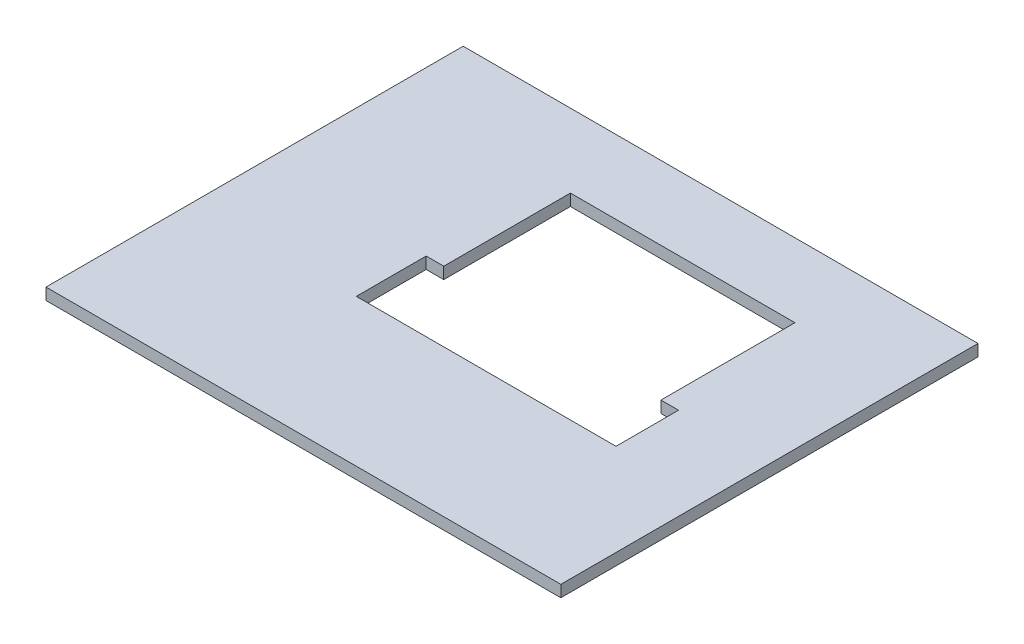
ISO-10303-21;
HEADER;
FILE_DESCRIPTION(('STEP AP214'),'2;1');
FILE_NAME('part.step','',(''),(''),'','','');
FILE_SCHEMA(('AUTOMOTIVE_DESIGN { 1 0 10303 214 1 1 1 1 }'));
ENDSEC;
DATA;
#1=APPLICATION_CONTEXT('core data for automotive mechanical design processes');
#2=APPLICATION_PROTOCOL_DEFINITION('international standard','automotive_design',2000,#1);
#3=PRODUCT_CONTEXT('',#1,'mechanical');
#4=PRODUCT('Part','Part','',(#3));
#5=PRODUCT_RELATED_PRODUCT_CATEGORY('part','',(#4));
#6=PRODUCT_DEFINITION_FORMATION('','',#4);
#7=PRODUCT_DEFINITION_CONTEXT('part definition',#1,'design');
#8=PRODUCT_DEFINITION('design','',#6,#7);
#9=PRODUCT_DEFINITION_SHAPE('','',#8);
#10=(LENGTH_UNIT() NAMED_UNIT(*) SI_UNIT(.MILLI.,.METRE.));
#11=(NAMED_UNIT(*) PLANE_ANGLE_UNIT() SI_UNIT($,.RADIAN.));
#12=(NAMED_UNIT(*) SI_UNIT($,.STERADIAN.) SOLID_ANGLE_UNIT());
#13=UNCERTAINTY_MEASURE_WITH_UNIT(LENGTH_MEASURE(1.E-05),#10,'distance_accuracy_value','');
#14=(GEOMETRIC_REPRESENTATION_CONTEXT(3) GLOBAL_UNCERTAINTY_ASSIGNED_CONTEXT((#13)) GLOBAL_UNIT_ASSIGNED_CONTEXT((#10,
#11,#12)) REPRESENTATION_CONTEXT('',''));
#15=CARTESIAN_POINT('',(0.,0.,0.));
#16=DIRECTION('',(0.,0.,1.));
#17=DIRECTION('',(1.,0.,0.));
#18=AXIS2_PLACEMENT_3D('',#15,#16,#17);
#19=CARTESIAN_POINT('',(-35.,1.5875,0.));
#20=DIRECTION('',(1.,0.,0.));
#21=DIRECTION('',(0.,0.,-1.));
#22=AXIS2_PLACEMENT_3D('',#19,#20,#21);
#23=PLANE('',#22);
#24=DIRECTION('',(0.,0.,1.));
#25=VECTOR('',#24,1.);
#26=CARTESIAN_POINT('',(-35.,0.,0.));
#27=LINE('',#26,#25);
#28=CARTESIAN_POINT('',(-35.,0.,-56.72));
#29=VERTEX_POINT('',#28);
#30=CARTESIAN_POINT('',(-35.,0.,0.));
#31=VERTEX_POINT('',#30);
#32=EDGE_CURVE('E274',#29,#31,#27,.T.);
#33=ORIENTED_EDGE('',*,*,#32,.T.);
#34=DIRECTION('',(0.,-1.,0.));
#35=VECTOR('',#34,1.);
#36=CARTESIAN_POINT('',(-35.,1.5875,0.));
#37=LINE('',#36,#35);
#38=CARTESIAN_POINT('',(-35.,1.5875,0.));
#39=VERTEX_POINT('',#38);
#40=EDGE_CURVE('E304',#39,#31,#37,.T.);
#41=ORIENTED_EDGE('',*,*,#40,.F.);
#42=DIRECTION('',(0.,0.,1.));
#43=VECTOR('',#42,1.);
#44=CARTESIAN_POINT('',(-35.,1.5875,0.));
#45=LINE('',#44,#43);
#46=CARTESIAN_POINT('',(-35.,1.5875,-56.72));
#47=VERTEX_POINT('',#46);
#48=EDGE_CURVE('E275',#47,#39,#45,.T.);
#49=ORIENTED_EDGE('',*,*,#48,.F.);
#50=DIRECTION('',(0.,-1.,0.));
#51=VECTOR('',#50,1.);
#52=CARTESIAN_POINT('',(-35.,1.5875,-56.72));
#53=LINE('',#52,#51);
#54=EDGE_CURVE('E288',#47,#29,#53,.T.);
#55=ORIENTED_EDGE('',*,*,#54,.T.);
#56=EDGE_LOOP('',(#33,#41,#49,#55));
#57=FACE_BOUND('',#56,.T.);
#58=ADVANCED_FACE('F57',(#57),#23,.F.);
#59=CARTESIAN_POINT('',(-35.,1.5875,0.));
#60=DIRECTION('',(0.,0.,-1.));
#61=DIRECTION('',(-1.,0.,0.));
#62=AXIS2_PLACEMENT_3D('',#59,#60,#61);
#63=PLANE('',#62);
#64=DIRECTION('',(1.,0.,0.));
#65=VECTOR('',#64,1.);
#66=CARTESIAN_POINT('',(-35.,0.,0.));
#67=LINE('',#66,#65);
#68=CARTESIAN_POINT('',(35.,0.,0.));
#69=VERTEX_POINT('',#68);
#70=EDGE_CURVE('E291',#31,#69,#67,.T.);
#71=ORIENTED_EDGE('',*,*,#70,.T.);
#72=DIRECTION('',(0.,-1.,0.));
#73=VECTOR('',#72,1.);
#74=CARTESIAN_POINT('',(35.,1.5875,0.));
#75=LINE('',#74,#73);
#76=CARTESIAN_POINT('',(35.,1.5875,0.));
#77=VERTEX_POINT('',#76);
#78=EDGE_CURVE('E301',#77,#69,#75,.T.);
#79=ORIENTED_EDGE('',*,*,#78,.F.);
#80=DIRECTION('',(1.,0.,0.));
#81=VECTOR('',#80,1.);
#82=CARTESIAN_POINT('',(-35.,1.5875,0.));
#83=LINE('',#82,#81);
#84=EDGE_CURVE('E281',#39,#77,#83,.T.);
#85=ORIENTED_EDGE('',*,*,#84,.F.);
#86=ORIENTED_EDGE('',*,*,#40,.T.);
#87=EDGE_LOOP('',(#71,#79,#85,#86));
#88=FACE_BOUND('',#87,.T.);
#89=ADVANCED_FACE('F380',(#88),#63,.F.);
#90=CARTESIAN_POINT('',(35.,1.5875,0.));
#91=DIRECTION('',(-1.,0.,0.));
#92=DIRECTION('',(0.,0.,1.));
#93=AXIS2_PLACEMENT_3D('',#90,#91,#92);
#94=PLANE('',#93);
#95=DIRECTION('',(0.,0.,-1.));
#96=VECTOR('',#95,1.);
#97=CARTESIAN_POINT('',(35.,0.,0.));
#98=LINE('',#97,#96);
#99=CARTESIAN_POINT('',(35.,0.,-56.72));
#100=VERTEX_POINT('',#99);
#101=EDGE_CURVE('E293',#69,#100,#98,.T.);
#102=ORIENTED_EDGE('',*,*,#101,.T.);
#103=DIRECTION('',(0.,-1.,0.));
#104=VECTOR('',#103,1.);
#105=CARTESIAN_POINT('',(35.,1.5875,-56.72));
#106=LINE('',#105,#104);
#107=CARTESIAN_POINT('',(35.,1.5875,-56.72));
#108=VERTEX_POINT('',#107);
#109=EDGE_CURVE('E298',#108,#100,#106,.T.);
#110=ORIENTED_EDGE('',*,*,#109,.F.);
#111=DIRECTION('',(0.,0.,-1.));
#112=VECTOR('',#111,1.);
#113=CARTESIAN_POINT('',(35.,1.5875,0.));
#114=LINE('',#113,#112);
#115=EDGE_CURVE('E284',#77,#108,#114,.T.);
#116=ORIENTED_EDGE('',*,*,#115,.F.);
#117=ORIENTED_EDGE('',*,*,#78,.T.);
#118=EDGE_LOOP('',(#102,#110,#116,#117));
#119=FACE_BOUND('',#118,.T.);
#120=ADVANCED_FACE('F385',(#119),#94,.F.);
#121=CARTESIAN_POINT('',(-35.,1.5875,-56.72));
#122=DIRECTION('',(0.,0.,1.));
#123=DIRECTION('',(1.,0.,0.));
#124=AXIS2_PLACEMENT_3D('',#121,#122,#123);
#125=PLANE('',#124);
#126=DIRECTION('',(-1.,0.,0.));
#127=VECTOR('',#126,1.);
#128=CARTESIAN_POINT('',(-35.,0.,-56.72));
#129=LINE('',#128,#127);
#130=EDGE_CURVE('E282',#100,#29,#129,.T.);
#131=ORIENTED_EDGE('',*,*,#130,.T.);
#132=ORIENTED_EDGE('',*,*,#54,.F.);
#133=DIRECTION('',(-1.,0.,0.));
#134=VECTOR('',#133,1.);
#135=CARTESIAN_POINT('',(-35.,1.5875,-56.72));
#136=LINE('',#135,#134);
#137=EDGE_CURVE('E286',#108,#47,#136,.T.);
#138=ORIENTED_EDGE('',*,*,#137,.F.);
#139=ORIENTED_EDGE('',*,*,#109,.T.);
#140=EDGE_LOOP('',(#131,#132,#138,#139));
#141=FACE_BOUND('',#140,.T.);
#142=ADVANCED_FACE('F398',(#141),#125,.F.);
#143=CARTESIAN_POINT('',(0.,1.5875,0.));
#144=DIRECTION('',(0.,-1.,0.));
#145=DIRECTION('',(0.,0.,-1.));
#146=AXIS2_PLACEMENT_3D('',#143,#144,#145);
#147=PLANE('',#146);
#148=CARTESIAN_POINT('',(-12.8099536822238,1.587500000334,-29.4999965155704));
#149=CARTESIAN_POINT('',(-12.8099536822238,1.587500000334,-26.3333310254204));
#150=CARTESIAN_POINT('',(-12.8099536822238,1.587500000334,-23.1666655352704));
#151=CARTESIAN_POINT('',(-12.8099536822238,1.587500000334,-20.0000000451204));
#152=(BOUNDED_CURVE() B_SPLINE_CURVE(3,(#148,#149,#150,#151),.UNSPECIFIED.,.F.,
.F.) B_SPLINE_CURVE_WITH_KNOTS((4,4),(0.,1.),
.UNSPECIFIED.) CURVE() GEOMETRIC_REPRESENTATION_ITEM() RATIONAL_B_SPLINE_CURVE((1.,1.,1.,1.)) REPRESENTATION_ITEM(''));
#153=CARTESIAN_POINT('',(-12.8099536822238,1.587500000334,-29.4999965155704));
#154=VERTEX_POINT('',#153);
#155=CARTESIAN_POINT('',(-12.8099536822238,1.587500000334,-20.0000000451204));
#156=VERTEX_POINT('',#155);
#157=EDGE_CURVE('E172',#154,#156,#152,.T.);
#158=ORIENTED_EDGE('',*,*,#157,.F.);
#159=CARTESIAN_POINT('',(-10.4199536822238,1.587500000334,-29.4999965155704));
#160=CARTESIAN_POINT('',(-11.2166203488905,1.587500000334,-29.4999965155704));
#161=CARTESIAN_POINT('',(-12.0132870155571,1.587500000334,-29.4999965155704));
#162=CARTESIAN_POINT('',(-12.8099536822238,1.587500000334,-29.4999965155704));
#163=(BOUNDED_CURVE() B_SPLINE_CURVE(3,(#159,#160,#161,#162),.UNSPECIFIED.,.F.,
.F.) B_SPLINE_CURVE_WITH_KNOTS((4,4),(0.,1.),
.UNSPECIFIED.) CURVE() GEOMETRIC_REPRESENTATION_ITEM() RATIONAL_B_SPLINE_CURVE((1.,1.,1.,1.)) REPRESENTATION_ITEM(''));
#164=CARTESIAN_POINT('',(-10.4199536822238,1.587500000334,-29.4999965155704));
#165=VERTEX_POINT('',#164);
#166=EDGE_CURVE('E179',#165,#154,#163,.T.);
#167=ORIENTED_EDGE('',*,*,#166,.F.);
#168=CARTESIAN_POINT('',(-10.4199536822238,1.587500000334,-46.7200000451204));
#169=CARTESIAN_POINT('',(-10.4199536822238,1.587500000334,-40.9799988686037));
#170=CARTESIAN_POINT('',(-10.4199536822238,1.587500000334,-35.2399976920871));
#171=CARTESIAN_POINT('',(-10.4199536822238,1.587500000334,-29.4999965155704));
#172=(BOUNDED_CURVE() B_SPLINE_CURVE(3,(#168,#169,#170,#171),.UNSPECIFIED.,.F.,
.F.) B_SPLINE_CURVE_WITH_KNOTS((4,4),(0.,1.),
.UNSPECIFIED.) CURVE() GEOMETRIC_REPRESENTATION_ITEM() RATIONAL_B_SPLINE_CURVE((1.,1.,1.,1.)) REPRESENTATION_ITEM(''));
#173=CARTESIAN_POINT('',(-10.4199536822238,1.5875,-46.7200000451204));
#174=VERTEX_POINT('',#173);
#175=EDGE_CURVE('E341',#174,#165,#172,.T.);
#176=ORIENTED_EDGE('',*,*,#175,.F.);
#177=CARTESIAN_POINT('',(20.1100463177762,1.587500000334,-46.7200000451204));
#178=CARTESIAN_POINT('',(9.93337965110952,1.587500000334,-46.7200000451204));
#179=CARTESIAN_POINT('',(-0.243287015557145,1.587500000334,-46.7200000451204));
#180=CARTESIAN_POINT('',(-10.4199536822238,1.587500000334,-46.7200000451204));
#181=(BOUNDED_CURVE() B_SPLINE_CURVE(3,(#177,#178,#179,#180),.UNSPECIFIED.,.F.,
.F.) B_SPLINE_CURVE_WITH_KNOTS((4,4),(0.,1.),
.UNSPECIFIED.) CURVE() GEOMETRIC_REPRESENTATION_ITEM() RATIONAL_B_SPLINE_CURVE((1.,1.,1.,1.)) REPRESENTATION_ITEM(''));
#182=CARTESIAN_POINT('',(20.1100463177762,1.587500000334,-46.7200000451204));
#183=VERTEX_POINT('',#182);
#184=EDGE_CURVE('E74',#183,#174,#181,.T.);
#185=ORIENTED_EDGE('',*,*,#184,.F.);
#186=CARTESIAN_POINT('',(20.1100463177762,1.587500000334,-28.5000000022704));
#187=CARTESIAN_POINT('',(20.1100463177762,1.587500000334,-34.5733333498871));
#188=CARTESIAN_POINT('',(20.1100463177762,1.587500000334,-40.6466666975037));
#189=CARTESIAN_POINT('',(20.1100463177762,1.587500000334,-46.7200000451204));
#190=(BOUNDED_CURVE() B_SPLINE_CURVE(3,(#186,#187,#188,#189),.UNSPECIFIED.,.F.,
.F.) B_SPLINE_CURVE_WITH_KNOTS((4,4),(0.,1.),
.UNSPECIFIED.) CURVE() GEOMETRIC_REPRESENTATION_ITEM() RATIONAL_B_SPLINE_CURVE((1.,1.,1.,1.)) REPRESENTATION_ITEM(''));
#191=CARTESIAN_POINT('',(20.1100463177762,1.587500000334,-28.5000000022704));
#192=VERTEX_POINT('',#191);
#193=EDGE_CURVE('E220',#192,#183,#190,.T.);
#194=ORIENTED_EDGE('',*,*,#193,.F.);
#195=CARTESIAN_POINT('',(22.5000000311962,1.587500000334,-28.5000000022704));
#196=CARTESIAN_POINT('',(21.7033487933895,1.587500000334,-28.5000000022704));
#197=CARTESIAN_POINT('',(20.9066975555829,1.587500000334,-28.5000000022704));
#198=CARTESIAN_POINT('',(20.1100463177762,1.587500000334,-28.5000000022704));
#199=(BOUNDED_CURVE() B_SPLINE_CURVE(3,(#195,#196,#197,#198),.UNSPECIFIED.,.F.,
.F.) B_SPLINE_CURVE_WITH_KNOTS((4,4),(0.,1.),
.UNSPECIFIED.) CURVE() GEOMETRIC_REPRESENTATION_ITEM() RATIONAL_B_SPLINE_CURVE((1.,1.,1.,1.)) REPRESENTATION_ITEM(''));
#200=CARTESIAN_POINT('',(22.5000000311962,1.587500000334,-28.5000000022704));
#201=VERTEX_POINT('',#200);
#202=EDGE_CURVE('E190',#201,#192,#199,.T.);
#203=ORIENTED_EDGE('',*,*,#202,.F.);
#204=CARTESIAN_POINT('',(22.5000000311962,1.587500000334,-20.0000000451204));
#205=CARTESIAN_POINT('',(22.5000000311962,1.587500000334,-22.8333333641704));
#206=CARTESIAN_POINT('',(22.5000000311962,1.587500000334,-25.6666666832204));
#207=CARTESIAN_POINT('',(22.5000000311962,1.587500000334,-28.5000000022704));
#208=(BOUNDED_CURVE() B_SPLINE_CURVE(3,(#204,#205,#206,#207),.UNSPECIFIED.,.F.,
.F.) B_SPLINE_CURVE_WITH_KNOTS((4,4),(0.,1.),
.UNSPECIFIED.) CURVE() GEOMETRIC_REPRESENTATION_ITEM() RATIONAL_B_SPLINE_CURVE((1.,1.,1.,1.)) REPRESENTATION_ITEM(''));
#209=CARTESIAN_POINT('',(22.5000000311962,1.587500000334,-20.0000000451204));
#210=VERTEX_POINT('',#209);
#211=EDGE_CURVE('E185',#210,#201,#208,.T.);
#212=ORIENTED_EDGE('',*,*,#211,.F.);
#213=CARTESIAN_POINT('',(-12.8099536822238,1.587500000334,-20.0000000451204));
#214=CARTESIAN_POINT('',(-1.03996911108382,1.587500000334,-20.0000000451204));
#215=CARTESIAN_POINT('',(10.7300154600562,1.587500000334,-20.0000000451204));
#216=CARTESIAN_POINT('',(22.5000000311962,1.587500000334,-20.0000000451204));
#217=(BOUNDED_CURVE() B_SPLINE_CURVE(3,(#213,#214,#215,#216),.UNSPECIFIED.,.F.,
.F.) B_SPLINE_CURVE_WITH_KNOTS((4,4),(0.,1.),
.UNSPECIFIED.) CURVE() GEOMETRIC_REPRESENTATION_ITEM() RATIONAL_B_SPLINE_CURVE((1.,1.,1.,1.)) REPRESENTATION_ITEM(''));
#218=EDGE_CURVE('E161',#156,#210,#217,.T.);
#219=ORIENTED_EDGE('',*,*,#218,.F.);
#220=EDGE_LOOP('',(#158,#167,#176,#185,#194,#203,#212,#219));
#221=FACE_BOUND('',#220,.T.);
#222=ORIENTED_EDGE('',*,*,#48,.T.);
#223=ORIENTED_EDGE('',*,*,#84,.T.);
#224=ORIENTED_EDGE('',*,*,#115,.T.);
#225=ORIENTED_EDGE('',*,*,#137,.T.);
#226=EDGE_LOOP('',(#222,#223,#224,#225));
#227=FACE_BOUND('',#226,.T.);
#228=ADVANCED_FACE('F181',(#221,#227),#147,.F.);
#229=CARTESIAN_POINT('',(0.,0.,0.));
#230=DIRECTION('',(0.,-1.,0.));
#231=DIRECTION('',(0.,0.,-1.));
#232=AXIS2_PLACEMENT_3D('',#229,#230,#231);
#233=PLANE('',#232);
#234=DIRECTION('',(1.,0.,0.));
#235=VECTOR('',#234,1.);
#236=CARTESIAN_POINT('',(0.,0.,-29.4999965155704));
#237=LINE('',#236,#235);
#238=CARTESIAN_POINT('',(-12.8099536822238,0.,-29.4999965155704));
#239=VERTEX_POINT('',#238);
#240=CARTESIAN_POINT('',(-10.4199536822238,0.,-29.4999965155704));
#241=VERTEX_POINT('',#240);
#242=EDGE_CURVE('E11',#239,#241,#237,.T.);
#243=ORIENTED_EDGE('',*,*,#242,.F.);
#244=DIRECTION('',(0.,0.,-1.));
#245=VECTOR('',#244,1.);
#246=CARTESIAN_POINT('',(-12.8099536822238,0.,0.));
#247=LINE('',#246,#245);
#248=CARTESIAN_POINT('',(-12.8099536822238,0.,-20.0000000451204));
#249=VERTEX_POINT('',#248);
#250=EDGE_CURVE('E64',#249,#239,#247,.T.);
#251=ORIENTED_EDGE('',*,*,#250,.F.);
#252=DIRECTION('',(-1.,0.,0.));
#253=VECTOR('',#252,1.);
#254=CARTESIAN_POINT('',(0.,0.,-20.0000000451204));
#255=LINE('',#254,#253);
#256=CARTESIAN_POINT('',(22.5000000311962,0.,-20.0000000451204));
#257=VERTEX_POINT('',#256);
#258=EDGE_CURVE('E164',#257,#249,#255,.T.);
#259=ORIENTED_EDGE('',*,*,#258,.F.);
#260=DIRECTION('',(0.,0.,1.));
#261=VECTOR('',#260,1.);
#262=CARTESIAN_POINT('',(22.5000000311962,0.,0.));
#263=LINE('',#262,#261);
#264=CARTESIAN_POINT('',(22.5000000311962,0.,-28.5000000022704));
#265=VERTEX_POINT('',#264);
#266=EDGE_CURVE('E315',#265,#257,#263,.T.);
#267=ORIENTED_EDGE('',*,*,#266,.F.);
#268=DIRECTION('',(1.,0.,0.));
#269=VECTOR('',#268,1.);
#270=CARTESIAN_POINT('',(0.,0.,-28.5000000022704));
#271=LINE('',#270,#269);
#272=CARTESIAN_POINT('',(20.1100463177762,0.,-28.5000000022704));
#273=VERTEX_POINT('',#272);
#274=EDGE_CURVE('E313',#273,#265,#271,.T.);
#275=ORIENTED_EDGE('',*,*,#274,.F.);
#276=DIRECTION('',(0.,0.,1.));
#277=VECTOR('',#276,1.);
#278=CARTESIAN_POINT('',(20.1100463177762,0.,0.));
#279=LINE('',#278,#277);
#280=CARTESIAN_POINT('',(20.1100463177762,0.,-46.7200000451204));
#281=VERTEX_POINT('',#280);
#282=EDGE_CURVE('E311',#281,#273,#279,.T.);
#283=ORIENTED_EDGE('',*,*,#282,.F.);
#284=DIRECTION('',(1.,0.,0.));
#285=VECTOR('',#284,1.);
#286=CARTESIAN_POINT('',(0.,0.,-46.7200000451204));
#287=LINE('',#286,#285);
#288=CARTESIAN_POINT('',(-10.4199536822238,0.,-46.7200000451204));
#289=VERTEX_POINT('',#288);
#290=EDGE_CURVE('E309',#289,#281,#287,.T.);
#291=ORIENTED_EDGE('',*,*,#290,.F.);
#292=DIRECTION('',(0.,0.,-1.));
#293=VECTOR('',#292,1.);
#294=CARTESIAN_POINT('',(-10.4199536822238,0.,0.));
#295=LINE('',#294,#293);
#296=EDGE_CURVE('E307',#241,#289,#295,.T.);
#297=ORIENTED_EDGE('',*,*,#296,.F.);
#298=EDGE_LOOP('',(#243,#251,#259,#267,#275,#283,#291,#297));
#299=FACE_BOUND('',#298,.T.);
#300=ORIENTED_EDGE('',*,*,#32,.F.);
#301=ORIENTED_EDGE('',*,*,#130,.F.);
#302=ORIENTED_EDGE('',*,*,#101,.F.);
#303=ORIENTED_EDGE('',*,*,#70,.F.);
#304=EDGE_LOOP('',(#300,#301,#302,#303));
#305=FACE_BOUND('',#304,.T.);
#306=ADVANCED_FACE('F322',(#299,#305),#233,.T.);
#307=CARTESIAN_POINT('',(-10.4199536822238,1.587500000334,-29.4999965155704));
#308=DIRECTION('',(0.,0.,-1.));
#309=DIRECTION('',(0.,-1.,0.));
#310=AXIS2_PLACEMENT_3D('',#307,#308,#309);
#311=PLANE('',#310);
#312=ORIENTED_EDGE('',*,*,#242,.T.);
#313=CARTESIAN_POINT('',(-10.4199536822238,-0.0124999996659984,-29.4999965155704));
#314=CARTESIAN_POINT('',(-10.4199536822238,0.520833333667302,-29.4999965155704));
#315=CARTESIAN_POINT('',(-10.4199536822238,1.0541666670007,-29.4999965155704));
#316=CARTESIAN_POINT('',(-10.4199536822238,1.587500000334,-29.4999965155704));
#317=(BOUNDED_CURVE() B_SPLINE_CURVE(3,(#313,#314,#315,#316),.UNSPECIFIED.,.F.,
.F.) B_SPLINE_CURVE_WITH_KNOTS((4,4),(0.,1.),
.UNSPECIFIED.) CURVE() GEOMETRIC_REPRESENTATION_ITEM() RATIONAL_B_SPLINE_CURVE((1.,1.,1.,1.)) REPRESENTATION_ITEM(''));
#318=EDGE_CURVE('E82',#241,#165,#317,.T.);
#319=ORIENTED_EDGE('',*,*,#318,.T.);
#320=ORIENTED_EDGE('',*,*,#166,.T.);
#321=CARTESIAN_POINT('',(-12.8099536822238,1.587500000334,-29.4999965155704));
#322=CARTESIAN_POINT('',(-12.8099536822238,1.0541666670007,-29.4999965155704));
#323=CARTESIAN_POINT('',(-12.8099536822238,0.520833333667302,-29.4999965155704));
#324=CARTESIAN_POINT('',(-12.8099536822238,-0.0124999996659984,-29.4999965155704));
#325=(BOUNDED_CURVE() B_SPLINE_CURVE(3,(#321,#322,#323,#324),.UNSPECIFIED.,.F.,
.F.) B_SPLINE_CURVE_WITH_KNOTS((4,4),(0.,1.),
.UNSPECIFIED.) CURVE() GEOMETRIC_REPRESENTATION_ITEM() RATIONAL_B_SPLINE_CURVE((1.,1.,1.,1.)) REPRESENTATION_ITEM(''));
#326=EDGE_CURVE('E168',#154,#239,#325,.T.);
#327=ORIENTED_EDGE('',*,*,#326,.T.);
#328=EDGE_LOOP('',(#312,#319,#320,#327));
#329=FACE_BOUND('',#328,.T.);
#330=ADVANCED_FACE('F320',(#329),#311,.F.);
#331=CARTESIAN_POINT('',(-12.8099536822238,-0.0124999996659984,-20.0000000451204));
#332=DIRECTION('',(-1.,0.,0.));
#333=DIRECTION('',(0.,0.,1.));
#334=AXIS2_PLACEMENT_3D('',#331,#332,#333);
#335=PLANE('',#334);
#336=ORIENTED_EDGE('',*,*,#250,.T.);
#337=ORIENTED_EDGE('',*,*,#326,.F.);
#338=ORIENTED_EDGE('',*,*,#157,.T.);
#339=CARTESIAN_POINT('',(-12.8099536822238,1.587500000334,-20.0000000451204));
#340=CARTESIAN_POINT('',(-12.8099536822238,1.0541666670007,-20.0000000451204));
#341=CARTESIAN_POINT('',(-12.8099536822238,0.520833333667302,-20.0000000451204));
#342=CARTESIAN_POINT('',(-12.8099536822238,-0.0124999996659984,-20.0000000451204));
#343=(BOUNDED_CURVE() B_SPLINE_CURVE(3,(#339,#340,#341,#342),.UNSPECIFIED.,.F.,
.F.) B_SPLINE_CURVE_WITH_KNOTS((4,4),(0.,1.),
.UNSPECIFIED.) CURVE() GEOMETRIC_REPRESENTATION_ITEM() RATIONAL_B_SPLINE_CURVE((1.,1.,1.,1.)) REPRESENTATION_ITEM(''));
#344=EDGE_CURVE('E156',#156,#249,#343,.T.);
#345=ORIENTED_EDGE('',*,*,#344,.T.);
#346=EDGE_LOOP('',(#336,#337,#338,#345));
#347=FACE_BOUND('',#346,.T.);
#348=ADVANCED_FACE('F173',(#347),#335,.F.);
#349=CARTESIAN_POINT('',(-12.8099536822238,-0.0124999996659984,-20.0000000451204));
#350=DIRECTION('',(0.,0.,1.));
#351=DIRECTION('',(1.,0.,0.));
#352=AXIS2_PLACEMENT_3D('',#349,#350,#351);
#353=PLANE('',#352);
#354=ORIENTED_EDGE('',*,*,#258,.T.);
#355=ORIENTED_EDGE('',*,*,#344,.F.);
#356=ORIENTED_EDGE('',*,*,#218,.T.);
#357=CARTESIAN_POINT('',(22.5000000311962,1.587500000334,-20.0000000451204));
#358=CARTESIAN_POINT('',(22.5000000311962,1.0541666670007,-20.0000000451204));
#359=CARTESIAN_POINT('',(22.5000000311962,0.520833333667302,-20.0000000451204));
#360=CARTESIAN_POINT('',(22.5000000311962,-0.0124999996659984,-20.0000000451204));
#361=(BOUNDED_CURVE() B_SPLINE_CURVE(3,(#357,#358,#359,#360),.UNSPECIFIED.,.F.,
.F.) B_SPLINE_CURVE_WITH_KNOTS((4,4),(0.,1.),
.UNSPECIFIED.) CURVE() GEOMETRIC_REPRESENTATION_ITEM() RATIONAL_B_SPLINE_CURVE((1.,1.,1.,1.)) REPRESENTATION_ITEM(''));
#362=EDGE_CURVE('E169',#210,#257,#361,.T.);
#363=ORIENTED_EDGE('',*,*,#362,.T.);
#364=EDGE_LOOP('',(#354,#355,#356,#363));
#365=FACE_BOUND('',#364,.T.);
#366=ADVANCED_FACE('F158',(#365),#353,.F.);
#367=CARTESIAN_POINT('',(22.5000000311962,1.587500000334,-20.0000000451204));
#368=DIRECTION('',(1.,0.,0.));
#369=DIRECTION('',(0.,1.,0.));
#370=AXIS2_PLACEMENT_3D('',#367,#368,#369);
#371=PLANE('',#370);
#372=ORIENTED_EDGE('',*,*,#266,.T.);
#373=ORIENTED_EDGE('',*,*,#362,.F.);
#374=ORIENTED_EDGE('',*,*,#211,.T.);
#375=CARTESIAN_POINT('',(22.5000000311962,1.587500000334,-28.5000000022704));
#376=CARTESIAN_POINT('',(22.5000000311962,1.0541666670007,-28.5000000022704));
#377=CARTESIAN_POINT('',(22.5000000311962,0.520833333667302,-28.5000000022704));
#378=CARTESIAN_POINT('',(22.5000000311962,-0.0124999996659984,-28.5000000022704));
#379=(BOUNDED_CURVE() B_SPLINE_CURVE(3,(#375,#376,#377,#378),.UNSPECIFIED.,.F.,
.F.) B_SPLINE_CURVE_WITH_KNOTS((4,4),(0.,1.),
.UNSPECIFIED.) CURVE() GEOMETRIC_REPRESENTATION_ITEM() RATIONAL_B_SPLINE_CURVE((1.,1.,1.,1.)) REPRESENTATION_ITEM(''));
#380=EDGE_CURVE('E221',#201,#265,#379,.T.);
#381=ORIENTED_EDGE('',*,*,#380,.T.);
#382=EDGE_LOOP('',(#372,#373,#374,#381));
#383=FACE_BOUND('',#382,.T.);
#384=ADVANCED_FACE('F370',(#383),#371,.F.);
#385=CARTESIAN_POINT('',(22.5000000311962,1.587500000334,-28.5000000022704));
#386=DIRECTION('',(0.,0.,-1.));
#387=DIRECTION('',(0.,-1.,0.));
#388=AXIS2_PLACEMENT_3D('',#385,#386,#387);
#389=PLANE('',#388);
#390=ORIENTED_EDGE('',*,*,#274,.T.);
#391=ORIENTED_EDGE('',*,*,#380,.F.);
#392=ORIENTED_EDGE('',*,*,#202,.T.);
#393=CARTESIAN_POINT('',(20.1100463177762,1.587500000334,-28.5000000022704));
#394=CARTESIAN_POINT('',(20.1100463177762,1.0541666670007,-28.5000000022704));
#395=CARTESIAN_POINT('',(20.1100463177762,0.520833333667302,-28.5000000022704));
#396=CARTESIAN_POINT('',(20.1100463177762,-0.0124999996659984,-28.5000000022704));
#397=(BOUNDED_CURVE() B_SPLINE_CURVE(3,(#393,#394,#395,#396),.UNSPECIFIED.,.F.,
.F.) B_SPLINE_CURVE_WITH_KNOTS((4,4),(0.,1.),
.UNSPECIFIED.) CURVE() GEOMETRIC_REPRESENTATION_ITEM() RATIONAL_B_SPLINE_CURVE((1.,1.,1.,1.)) REPRESENTATION_ITEM(''));
#398=EDGE_CURVE('E230',#192,#273,#397,.T.);
#399=ORIENTED_EDGE('',*,*,#398,.T.);
#400=EDGE_LOOP('',(#390,#391,#392,#399));
#401=FACE_BOUND('',#400,.T.);
#402=ADVANCED_FACE('F367',(#401),#389,.F.);
#403=CARTESIAN_POINT('',(20.1100463177762,-0.0124999996659984,-28.5000000022704));
#404=DIRECTION('',(1.,0.,0.));
#405=DIRECTION('',(0.,1.,0.));
#406=AXIS2_PLACEMENT_3D('',#403,#404,#405);
#407=PLANE('',#406);
#408=ORIENTED_EDGE('',*,*,#282,.T.);
#409=ORIENTED_EDGE('',*,*,#398,.F.);
#410=ORIENTED_EDGE('',*,*,#193,.T.);
#411=CARTESIAN_POINT('',(20.1100463177762,1.587500000334,-46.7200000451204));
#412=CARTESIAN_POINT('',(20.1100463177762,1.0541666670007,-46.7200000451204));
#413=CARTESIAN_POINT('',(20.1100463177762,0.520833333667302,-46.7200000451204));
#414=CARTESIAN_POINT('',(20.1100463177762,-0.0124999996659984,-46.7200000451204));
#415=(BOUNDED_CURVE() B_SPLINE_CURVE(3,(#411,#412,#413,#414),.UNSPECIFIED.,.F.,
.F.) B_SPLINE_CURVE_WITH_KNOTS((4,4),(0.,1.),
.UNSPECIFIED.) CURVE() GEOMETRIC_REPRESENTATION_ITEM() RATIONAL_B_SPLINE_CURVE((1.,1.,1.,1.)) REPRESENTATION_ITEM(''));
#416=EDGE_CURVE('E204',#183,#281,#415,.T.);
#417=ORIENTED_EDGE('',*,*,#416,.T.);
#418=EDGE_LOOP('',(#408,#409,#410,#417));
#419=FACE_BOUND('',#418,.T.);
#420=ADVANCED_FACE('F364',(#419),#407,.F.);
#421=CARTESIAN_POINT('',(20.1100463177762,-0.0124999996659984,-46.7200000451204));
#422=DIRECTION('',(0.,0.,-1.));
#423=DIRECTION('',(0.,-1.,0.));
#424=AXIS2_PLACEMENT_3D('',#421,#422,#423);
#425=PLANE('',#424);
#426=ORIENTED_EDGE('',*,*,#290,.T.);
#427=ORIENTED_EDGE('',*,*,#416,.F.);
#428=ORIENTED_EDGE('',*,*,#184,.T.);
#429=CARTESIAN_POINT('',(-10.4199536822238,1.587500000334,-46.7200000451204));
#430=CARTESIAN_POINT('',(-10.4199536822238,1.0541666670007,-46.7200000451204));
#431=CARTESIAN_POINT('',(-10.4199536822238,0.520833333667302,-46.7200000451204));
#432=CARTESIAN_POINT('',(-10.4199536822238,-0.0124999996659984,-46.7200000451204));
#433=(BOUNDED_CURVE() B_SPLINE_CURVE(3,(#429,#430,#431,#432),.UNSPECIFIED.,.F.,
.F.) B_SPLINE_CURVE_WITH_KNOTS((4,4),(0.,1.),
.UNSPECIFIED.) CURVE() GEOMETRIC_REPRESENTATION_ITEM() RATIONAL_B_SPLINE_CURVE((1.,1.,1.,1.)) REPRESENTATION_ITEM(''));
#434=EDGE_CURVE('E205',#174,#289,#433,.T.);
#435=ORIENTED_EDGE('',*,*,#434,.T.);
#436=EDGE_LOOP('',(#426,#427,#428,#435));
#437=FACE_BOUND('',#436,.T.);
#438=ADVANCED_FACE('F328',(#437),#425,.F.);
#439=CARTESIAN_POINT('',(-10.4199536822238,-0.0124999996659984,-46.7200000451204));
#440=DIRECTION('',(-1.,0.,0.));
#441=DIRECTION('',(0.,0.,1.));
#442=AXIS2_PLACEMENT_3D('',#439,#440,#441);
#443=PLANE('',#442);
#444=ORIENTED_EDGE('',*,*,#296,.T.);
#445=ORIENTED_EDGE('',*,*,#434,.F.);
#446=ORIENTED_EDGE('',*,*,#175,.T.);
#447=ORIENTED_EDGE('',*,*,#318,.F.);
#448=EDGE_LOOP('',(#444,#445,#446,#447));
#449=FACE_BOUND('',#448,.T.);
#450=ADVANCED_FACE('F326',(#449),#443,.F.);
#451=CLOSED_SHELL('',(#58,#89,#120,#142,#228,#306,#330,#348,#366,#384,#402,#420,#438,#450));
#452=MANIFOLD_SOLID_BREP('B2',#451);
#453=ADVANCED_BREP_SHAPE_REPRESENTATION('',(#18,#452),#14);
#454=SHAPE_DEFINITION_REPRESENTATION(#9,#453);
ENDSEC;
END-ISO-10303-21;
